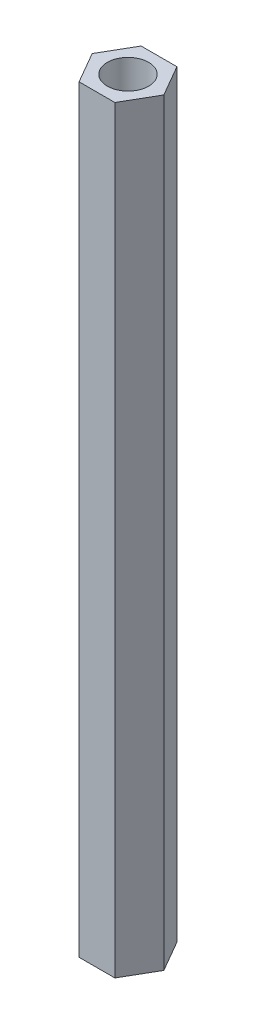
ISO-10303-21;
HEADER;
FILE_DESCRIPTION(('STEP AP214'),'2;1');
FILE_NAME('part.step','',(''),(''),'','','');
FILE_SCHEMA(('AUTOMOTIVE_DESIGN { 1 0 10303 214 1 1 1 1 }'));
ENDSEC;
DATA;
#1=APPLICATION_CONTEXT('core data for automotive mechanical design processes');
#2=APPLICATION_PROTOCOL_DEFINITION('international standard','automotive_design',2000,#1);
#3=PRODUCT_CONTEXT('',#1,'mechanical');
#4=PRODUCT('Part','Part','',(#3));
#5=PRODUCT_RELATED_PRODUCT_CATEGORY('part','',(#4));
#6=PRODUCT_DEFINITION_FORMATION('','',#4);
#7=PRODUCT_DEFINITION_CONTEXT('part definition',#1,'design');
#8=PRODUCT_DEFINITION('design','',#6,#7);
#9=PRODUCT_DEFINITION_SHAPE('','',#8);
#10=(LENGTH_UNIT() NAMED_UNIT(*) SI_UNIT(.MILLI.,.METRE.));
#11=(NAMED_UNIT(*) PLANE_ANGLE_UNIT() SI_UNIT($,.RADIAN.));
#12=(NAMED_UNIT(*) SI_UNIT($,.STERADIAN.) SOLID_ANGLE_UNIT());
#13=UNCERTAINTY_MEASURE_WITH_UNIT(LENGTH_MEASURE(1.E-05),#10,'distance_accuracy_value','');
#14=(GEOMETRIC_REPRESENTATION_CONTEXT(3) GLOBAL_UNCERTAINTY_ASSIGNED_CONTEXT((#13)) GLOBAL_UNIT_ASSIGNED_CONTEXT((#10,
#11,#12)) REPRESENTATION_CONTEXT('',''));
#15=CARTESIAN_POINT('',(0.,0.,0.));
#16=DIRECTION('',(0.,0.,1.));
#17=DIRECTION('',(1.,0.,0.));
#18=AXIS2_PLACEMENT_3D('',#15,#16,#17);
#19=CARTESIAN_POINT('',(0.,55.,0.));
#20=DIRECTION('',(0.,1.,0.));
#21=DIRECTION('',(0.,0.,1.));
#22=AXIS2_PLACEMENT_3D('',#19,#20,#21);
#23=PLANE('',#22);
#24=DIRECTION('',(0.499999999999995,0.,-0.866025403784442));
#25=VECTOR('',#24,1.);
#26=CARTESIAN_POINT('',(1.29903810567668,55.,2.24999999999998));
#27=LINE('',#26,#25);
#28=CARTESIAN_POINT('',(1.29903810567668,55.,2.24999999999998));
#29=VERTEX_POINT('',#28);
#30=CARTESIAN_POINT('',(2.59807621135331,55.,0.));
#31=VERTEX_POINT('',#30);
#32=EDGE_CURVE('E148',#29,#31,#27,.T.);
#33=ORIENTED_EDGE('',*,*,#32,.T.);
#34=DIRECTION('',(-0.500000000000001,0.,-0.866025403784438));
#35=VECTOR('',#34,1.);
#36=CARTESIAN_POINT('',(2.59807621135331,55.,0.));
#37=LINE('',#36,#35);
#38=CARTESIAN_POINT('',(1.29903810567665,55.,-2.25));
#39=VERTEX_POINT('',#38);
#40=EDGE_CURVE('E96',#31,#39,#37,.T.);
#41=ORIENTED_EDGE('',*,*,#40,.T.);
#42=DIRECTION('',(-1.,0.,0.));
#43=VECTOR('',#42,1.);
#44=CARTESIAN_POINT('',(1.29903810567665,55.,-2.25));
#45=LINE('',#44,#43);
#46=CARTESIAN_POINT('',(-1.29903810567666,55.,-2.24999999999999));
#47=VERTEX_POINT('',#46);
#48=EDGE_CURVE('E109',#39,#47,#45,.T.);
#49=ORIENTED_EDGE('',*,*,#48,.T.);
#50=DIRECTION('',(-0.499999999999995,0.,0.866025403784442));
#51=VECTOR('',#50,1.);
#52=CARTESIAN_POINT('',(-1.29903810567666,55.,-2.24999999999999));
#53=LINE('',#52,#51);
#54=CARTESIAN_POINT('',(-2.59807621135331,55.,0.));
#55=VERTEX_POINT('',#54);
#56=EDGE_CURVE('E103',#47,#55,#53,.T.);
#57=ORIENTED_EDGE('',*,*,#56,.T.);
#58=DIRECTION('',(0.500000000000007,0.,0.866025403784435));
#59=VECTOR('',#58,1.);
#60=CARTESIAN_POINT('',(-2.59807621135331,55.,0.));
#61=LINE('',#60,#59);
#62=CARTESIAN_POINT('',(-1.29903810567663,55.,2.25));
#63=VERTEX_POINT('',#62);
#64=EDGE_CURVE('E107',#55,#63,#61,.T.);
#65=ORIENTED_EDGE('',*,*,#64,.T.);
#66=DIRECTION('',(1.,0.,0.));
#67=VECTOR('',#66,1.);
#68=CARTESIAN_POINT('',(-1.29903810567663,55.,2.25));
#69=LINE('',#68,#67);
#70=EDGE_CURVE('E59',#63,#29,#69,.T.);
#71=ORIENTED_EDGE('',*,*,#70,.T.);
#72=EDGE_LOOP('',(#33,#41,#49,#57,#65,#71));
#73=FACE_BOUND('',#72,.T.);
#74=CARTESIAN_POINT('',(0.,55.,0.));
#75=DIRECTION('',(0.,1.,0.));
#76=DIRECTION('',(0.,0.,1.));
#77=AXIS2_PLACEMENT_3D('',#74,#75,#76);
#78=CIRCLE('',#77,1.5);
#79=CARTESIAN_POINT('',(0.,55.,1.5));
#80=VERTEX_POINT('',#79);
#81=EDGE_CURVE('E136',#80,#80,#78,.T.);
#82=ORIENTED_EDGE('',*,*,#81,.F.);
#83=EDGE_LOOP('',(#82));
#84=FACE_BOUND('',#83,.T.);
#85=ADVANCED_FACE('F41',(#73,#84),#23,.T.);
#86=CARTESIAN_POINT('',(0.,0.,0.));
#87=DIRECTION('',(0.,1.,0.));
#88=DIRECTION('',(0.,0.,1.));
#89=AXIS2_PLACEMENT_3D('',#86,#87,#88);
#90=PLANE('',#89);
#91=DIRECTION('',(0.499999999999995,0.,-0.866025403784442));
#92=VECTOR('',#91,1.);
#93=CARTESIAN_POINT('',(1.29903810567668,0.,2.24999999999998));
#94=LINE('',#93,#92);
#95=CARTESIAN_POINT('',(1.29903810567668,0.,2.24999999999998));
#96=VERTEX_POINT('',#95);
#97=CARTESIAN_POINT('',(2.59807621135331,0.,0.));
#98=VERTEX_POINT('',#97);
#99=EDGE_CURVE('E131',#96,#98,#94,.T.);
#100=ORIENTED_EDGE('',*,*,#99,.F.);
#101=DIRECTION('',(1.,0.,0.));
#102=VECTOR('',#101,1.);
#103=CARTESIAN_POINT('',(-1.29903810567663,0.,2.25));
#104=LINE('',#103,#102);
#105=CARTESIAN_POINT('',(-1.29903810567663,0.,2.25));
#106=VERTEX_POINT('',#105);
#107=EDGE_CURVE('E88',#106,#96,#104,.T.);
#108=ORIENTED_EDGE('',*,*,#107,.F.);
#109=DIRECTION('',(0.500000000000007,0.,0.866025403784435));
#110=VECTOR('',#109,1.);
#111=CARTESIAN_POINT('',(-2.59807621135331,0.,0.));
#112=LINE('',#111,#110);
#113=CARTESIAN_POINT('',(-2.59807621135331,0.,0.));
#114=VERTEX_POINT('',#113);
#115=EDGE_CURVE('E82',#114,#106,#112,.T.);
#116=ORIENTED_EDGE('',*,*,#115,.F.);
#117=DIRECTION('',(-0.499999999999995,0.,0.866025403784442));
#118=VECTOR('',#117,1.);
#119=CARTESIAN_POINT('',(-1.29903810567666,0.,-2.24999999999999));
#120=LINE('',#119,#118);
#121=CARTESIAN_POINT('',(-1.29903810567666,0.,-2.24999999999999));
#122=VERTEX_POINT('',#121);
#123=EDGE_CURVE('E118',#122,#114,#120,.T.);
#124=ORIENTED_EDGE('',*,*,#123,.F.);
#125=DIRECTION('',(-1.,0.,0.));
#126=VECTOR('',#125,1.);
#127=CARTESIAN_POINT('',(1.29903810567665,0.,-2.25));
#128=LINE('',#127,#126);
#129=CARTESIAN_POINT('',(1.29903810567665,0.,-2.25));
#130=VERTEX_POINT('',#129);
#131=EDGE_CURVE('E139',#130,#122,#128,.T.);
#132=ORIENTED_EDGE('',*,*,#131,.F.);
#133=DIRECTION('',(-0.500000000000001,0.,-0.866025403784438));
#134=VECTOR('',#133,1.);
#135=CARTESIAN_POINT('',(2.59807621135331,0.,0.));
#136=LINE('',#135,#134);
#137=EDGE_CURVE('E135',#98,#130,#136,.T.);
#138=ORIENTED_EDGE('',*,*,#137,.F.);
#139=EDGE_LOOP('',(#100,#108,#116,#124,#132,#138));
#140=FACE_BOUND('',#139,.T.);
#141=CARTESIAN_POINT('',(0.,0.,0.));
#142=DIRECTION('',(0.,1.,0.));
#143=DIRECTION('',(0.,0.,1.));
#144=AXIS2_PLACEMENT_3D('',#141,#142,#143);
#145=CIRCLE('',#144,1.5);
#146=CARTESIAN_POINT('',(0.,0.,1.5));
#147=VERTEX_POINT('',#146);
#148=EDGE_CURVE('E245',#147,#147,#145,.T.);
#149=ORIENTED_EDGE('',*,*,#148,.T.);
#150=EDGE_LOOP('',(#149));
#151=FACE_BOUND('',#150,.T.);
#152=ADVANCED_FACE('F161',(#140,#151),#90,.F.);
#153=CARTESIAN_POINT('',(1.29903810567668,55.,2.24999999999998));
#154=DIRECTION('',(-0.866025403784442,0.,-0.499999999999995));
#155=DIRECTION('',(-0.499999999999995,0.,0.866025403784442));
#156=AXIS2_PLACEMENT_3D('',#153,#154,#155);
#157=PLANE('',#156);
#158=ORIENTED_EDGE('',*,*,#99,.T.);
#159=DIRECTION('',(0.,-1.,0.));
#160=VECTOR('',#159,1.);
#161=CARTESIAN_POINT('',(2.59807621135331,55.,0.));
#162=LINE('',#161,#160);
#163=EDGE_CURVE('E11',#31,#98,#162,.T.);
#164=ORIENTED_EDGE('',*,*,#163,.F.);
#165=ORIENTED_EDGE('',*,*,#32,.F.);
#166=DIRECTION('',(0.,-1.,0.));
#167=VECTOR('',#166,1.);
#168=CARTESIAN_POINT('',(1.29903810567668,55.,2.24999999999998));
#169=LINE('',#168,#167);
#170=EDGE_CURVE('E127',#29,#96,#169,.T.);
#171=ORIENTED_EDGE('',*,*,#170,.T.);
#172=EDGE_LOOP('',(#158,#164,#165,#171));
#173=FACE_BOUND('',#172,.T.);
#174=ADVANCED_FACE('F43',(#173),#157,.F.);
#175=CARTESIAN_POINT('',(2.59807621135331,55.,0.));
#176=DIRECTION('',(-0.866025403784438,0.,0.500000000000001));
#177=DIRECTION('',(0.500000000000001,0.,0.866025403784438));
#178=AXIS2_PLACEMENT_3D('',#175,#176,#177);
#179=PLANE('',#178);
#180=ORIENTED_EDGE('',*,*,#137,.T.);
#181=DIRECTION('',(0.,-1.,0.));
#182=VECTOR('',#181,1.);
#183=CARTESIAN_POINT('',(1.29903810567665,55.,-2.25));
#184=LINE('',#183,#182);
#185=EDGE_CURVE('E51',#39,#130,#184,.T.);
#186=ORIENTED_EDGE('',*,*,#185,.F.);
#187=ORIENTED_EDGE('',*,*,#40,.F.);
#188=ORIENTED_EDGE('',*,*,#163,.T.);
#189=EDGE_LOOP('',(#180,#186,#187,#188));
#190=FACE_BOUND('',#189,.T.);
#191=ADVANCED_FACE('F186',(#190),#179,.F.);
#192=CARTESIAN_POINT('',(1.29903810567665,55.,-2.25));
#193=DIRECTION('',(0.,0.,1.));
#194=DIRECTION('',(1.,0.,0.));
#195=AXIS2_PLACEMENT_3D('',#192,#193,#194);
#196=PLANE('',#195);
#197=ORIENTED_EDGE('',*,*,#131,.T.);
#198=DIRECTION('',(0.,-1.,0.));
#199=VECTOR('',#198,1.);
#200=CARTESIAN_POINT('',(-1.29903810567666,55.,-2.24999999999999));
#201=LINE('',#200,#199);
#202=EDGE_CURVE('E120',#47,#122,#201,.T.);
#203=ORIENTED_EDGE('',*,*,#202,.F.);
#204=ORIENTED_EDGE('',*,*,#48,.F.);
#205=ORIENTED_EDGE('',*,*,#185,.T.);
#206=EDGE_LOOP('',(#197,#203,#204,#205));
#207=FACE_BOUND('',#206,.T.);
#208=ADVANCED_FACE('F158',(#207),#196,.F.);
#209=CARTESIAN_POINT('',(-1.29903810567666,55.,-2.24999999999999));
#210=DIRECTION('',(0.866025403784442,0.,0.499999999999995));
#211=DIRECTION('',(0.499999999999995,0.,-0.866025403784442));
#212=AXIS2_PLACEMENT_3D('',#209,#210,#211);
#213=PLANE('',#212);
#214=ORIENTED_EDGE('',*,*,#123,.T.);
#215=DIRECTION('',(0.,-1.,0.));
#216=VECTOR('',#215,1.);
#217=CARTESIAN_POINT('',(-2.59807621135331,55.,0.));
#218=LINE('',#217,#216);
#219=EDGE_CURVE('E115',#55,#114,#218,.T.);
#220=ORIENTED_EDGE('',*,*,#219,.F.);
#221=ORIENTED_EDGE('',*,*,#56,.F.);
#222=ORIENTED_EDGE('',*,*,#202,.T.);
#223=EDGE_LOOP('',(#214,#220,#221,#222));
#224=FACE_BOUND('',#223,.T.);
#225=ADVANCED_FACE('F116',(#224),#213,.F.);
#226=CARTESIAN_POINT('',(-2.59807621135331,55.,0.));
#227=DIRECTION('',(0.866025403784435,0.,-0.500000000000007));
#228=DIRECTION('',(-0.500000000000007,0.,-0.866025403784435));
#229=AXIS2_PLACEMENT_3D('',#226,#227,#228);
#230=PLANE('',#229);
#231=ORIENTED_EDGE('',*,*,#115,.T.);
#232=DIRECTION('',(0.,-1.,0.));
#233=VECTOR('',#232,1.);
#234=CARTESIAN_POINT('',(-1.29903810567663,55.,2.25));
#235=LINE('',#234,#233);
#236=EDGE_CURVE('E121',#63,#106,#235,.T.);
#237=ORIENTED_EDGE('',*,*,#236,.F.);
#238=ORIENTED_EDGE('',*,*,#64,.F.);
#239=ORIENTED_EDGE('',*,*,#219,.T.);
#240=EDGE_LOOP('',(#231,#237,#238,#239));
#241=FACE_BOUND('',#240,.T.);
#242=ADVANCED_FACE('F123',(#241),#230,.F.);
#243=CARTESIAN_POINT('',(-1.29903810567663,55.,2.25));
#244=DIRECTION('',(0.,0.,-1.));
#245=DIRECTION('',(-1.,0.,0.));
#246=AXIS2_PLACEMENT_3D('',#243,#244,#245);
#247=PLANE('',#246);
#248=ORIENTED_EDGE('',*,*,#107,.T.);
#249=ORIENTED_EDGE('',*,*,#170,.F.);
#250=ORIENTED_EDGE('',*,*,#70,.F.);
#251=ORIENTED_EDGE('',*,*,#236,.T.);
#252=EDGE_LOOP('',(#248,#249,#250,#251));
#253=FACE_BOUND('',#252,.T.);
#254=ADVANCED_FACE('F166',(#253),#247,.F.);
#255=CARTESIAN_POINT('',(0.,55.,0.));
#256=DIRECTION('',(0.,-1.,0.));
#257=DIRECTION('',(0.,0.,-1.));
#258=AXIS2_PLACEMENT_3D('',#255,#256,#257);
#259=CYLINDRICAL_SURFACE('',#258,1.5);
#260=ORIENTED_EDGE('',*,*,#81,.T.);
#261=EDGE_LOOP('',(#260));
#262=FACE_BOUND('',#261,.T.);
#263=ORIENTED_EDGE('',*,*,#148,.F.);
#264=EDGE_LOOP('',(#263));
#265=FACE_BOUND('',#264,.T.);
#266=ADVANCED_FACE('F168',(#262,#265),#259,.F.);
#267=CLOSED_SHELL('',(#85,#152,#174,#191,#208,#225,#242,#254,#266));
#268=MANIFOLD_SOLID_BREP('B2',#267);
#269=ADVANCED_BREP_SHAPE_REPRESENTATION('',(#18,#268),#14);
#270=SHAPE_DEFINITION_REPRESENTATION(#9,#269);
ENDSEC;
END-ISO-10303-21;
